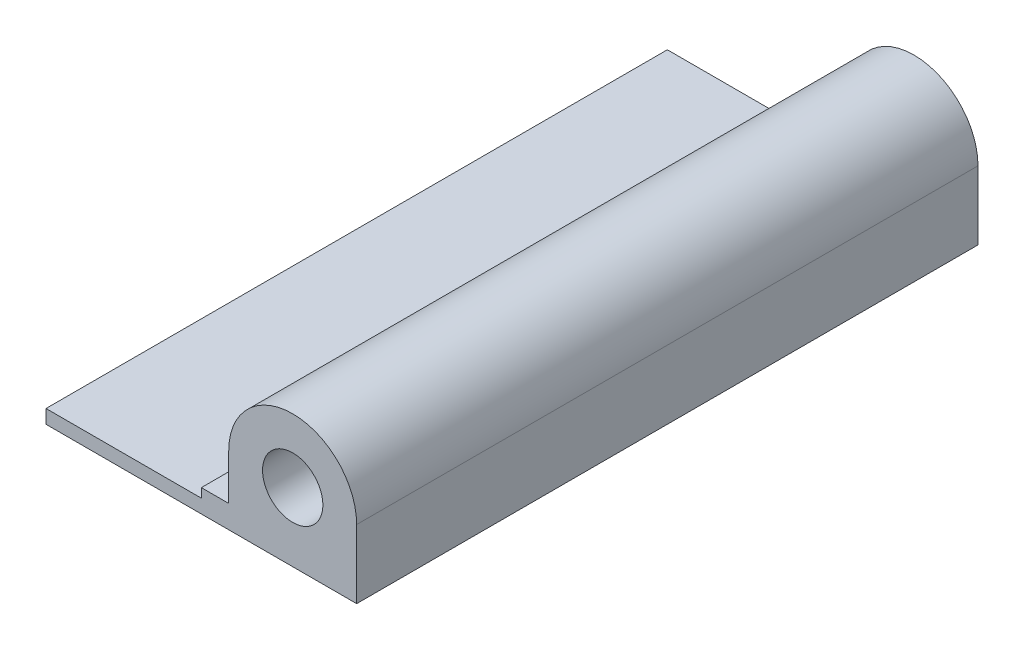
ISO-10303-21;
HEADER;
FILE_DESCRIPTION(('STEP AP214'),'2;1');
FILE_NAME('part.step','',(''),(''),'','','');
FILE_SCHEMA(('AUTOMOTIVE_DESIGN { 1 0 10303 214 1 1 1 1 }'));
ENDSEC;
DATA;
#1=APPLICATION_CONTEXT('core data for automotive mechanical design processes');
#2=APPLICATION_PROTOCOL_DEFINITION('international standard','automotive_design',2000,#1);
#3=PRODUCT_CONTEXT('',#1,'mechanical');
#4=PRODUCT('Part','Part','',(#3));
#5=PRODUCT_RELATED_PRODUCT_CATEGORY('part','',(#4));
#6=PRODUCT_DEFINITION_FORMATION('','',#4);
#7=PRODUCT_DEFINITION_CONTEXT('part definition',#1,'design');
#8=PRODUCT_DEFINITION('design','',#6,#7);
#9=PRODUCT_DEFINITION_SHAPE('','',#8);
#10=(LENGTH_UNIT() NAMED_UNIT(*) SI_UNIT(.MILLI.,.METRE.));
#11=(NAMED_UNIT(*) PLANE_ANGLE_UNIT() SI_UNIT($,.RADIAN.));
#12=(NAMED_UNIT(*) SI_UNIT($,.STERADIAN.) SOLID_ANGLE_UNIT());
#13=UNCERTAINTY_MEASURE_WITH_UNIT(LENGTH_MEASURE(1.E-05),#10,'distance_accuracy_value','');
#14=(GEOMETRIC_REPRESENTATION_CONTEXT(3) GLOBAL_UNCERTAINTY_ASSIGNED_CONTEXT((#13)) GLOBAL_UNIT_ASSIGNED_CONTEXT((#10,
#11,#12)) REPRESENTATION_CONTEXT('',''));
#15=CARTESIAN_POINT('',(0.,0.,0.));
#16=DIRECTION('',(0.,0.,1.));
#17=DIRECTION('',(1.,0.,0.));
#18=AXIS2_PLACEMENT_3D('',#15,#16,#17);
#19=CARTESIAN_POINT('',(27.0000000000141,7.5,0.));
#20=DIRECTION('',(0.,0.,1.));
#21=DIRECTION('',(1.,0.,0.));
#22=AXIS2_PLACEMENT_3D('',#19,#20,#21);
#23=CYLINDRICAL_SURFACE('',#22,7.00000000000012);
#24=CARTESIAN_POINT('',(27.0000000000141,7.5,68.));
#25=DIRECTION('',(0.,0.,1.));
#26=DIRECTION('',(1.,0.,0.));
#27=AXIS2_PLACEMENT_3D('',#24,#25,#26);
#28=CIRCLE('',#27,7.00000000000012);
#29=CARTESIAN_POINT('',(34.0000000000142,7.5,68.));
#30=VERTEX_POINT('',#29);
#31=CARTESIAN_POINT('',(20.000000000014,7.5,68.));
#32=VERTEX_POINT('',#31);
#33=EDGE_CURVE('E132',#30,#32,#28,.T.);
#34=ORIENTED_EDGE('',*,*,#33,.F.);
#35=DIRECTION('',(0.,0.,1.));
#36=VECTOR('',#35,1.);
#37=CARTESIAN_POINT('',(34.0000000000142,7.5,0.));
#38=LINE('',#37,#36);
#39=CARTESIAN_POINT('',(34.0000000000142,7.5,0.));
#40=VERTEX_POINT('',#39);
#41=EDGE_CURVE('E11',#40,#30,#38,.T.);
#42=ORIENTED_EDGE('',*,*,#41,.F.);
#43=CARTESIAN_POINT('',(27.0000000000141,7.5,0.));
#44=DIRECTION('',(0.,0.,1.));
#45=DIRECTION('',(1.,0.,0.));
#46=AXIS2_PLACEMENT_3D('',#43,#44,#45);
#47=CIRCLE('',#46,7.00000000000012);
#48=CARTESIAN_POINT('',(20.000000000014,7.5,0.));
#49=VERTEX_POINT('',#48);
#50=EDGE_CURVE('E153',#40,#49,#47,.T.);
#51=ORIENTED_EDGE('',*,*,#50,.T.);
#52=DIRECTION('',(0.,0.,1.));
#53=VECTOR('',#52,1.);
#54=CARTESIAN_POINT('',(20.000000000014,7.5,0.));
#55=LINE('',#54,#53);
#56=EDGE_CURVE('E38',#49,#32,#55,.T.);
#57=ORIENTED_EDGE('',*,*,#56,.T.);
#58=EDGE_LOOP('',(#34,#42,#51,#57));
#59=FACE_BOUND('',#58,.T.);
#60=ADVANCED_FACE('F35',(#59),#23,.T.);
#61=CARTESIAN_POINT('',(34.0000000000142,0.,0.));
#62=DIRECTION('',(1.,0.,0.));
#63=DIRECTION('',(0.,0.,-1.));
#64=AXIS2_PLACEMENT_3D('',#61,#62,#63);
#65=PLANE('',#64);
#66=DIRECTION('',(0.,1.,0.));
#67=VECTOR('',#66,1.);
#68=CARTESIAN_POINT('',(34.0000000000142,0.,68.));
#69=LINE('',#68,#67);
#70=CARTESIAN_POINT('',(34.0000000000142,0.,68.));
#71=VERTEX_POINT('',#70);
#72=EDGE_CURVE('E151',#71,#30,#69,.T.);
#73=ORIENTED_EDGE('',*,*,#72,.F.);
#74=DIRECTION('',(0.,0.,1.));
#75=VECTOR('',#74,1.);
#76=CARTESIAN_POINT('',(34.0000000000142,0.,0.));
#77=LINE('',#76,#75);
#78=CARTESIAN_POINT('',(34.0000000000142,0.,0.));
#79=VERTEX_POINT('',#78);
#80=EDGE_CURVE('E44',#79,#71,#77,.T.);
#81=ORIENTED_EDGE('',*,*,#80,.F.);
#82=DIRECTION('',(0.,1.,0.));
#83=VECTOR('',#82,1.);
#84=CARTESIAN_POINT('',(34.0000000000142,0.,0.));
#85=LINE('',#84,#83);
#86=EDGE_CURVE('E122',#79,#40,#85,.T.);
#87=ORIENTED_EDGE('',*,*,#86,.T.);
#88=ORIENTED_EDGE('',*,*,#41,.T.);
#89=EDGE_LOOP('',(#73,#81,#87,#88));
#90=FACE_BOUND('',#89,.T.);
#91=ADVANCED_FACE('F165',(#90),#65,.T.);
#92=CARTESIAN_POINT('',(0.,0.,0.));
#93=DIRECTION('',(0.,-1.,0.));
#94=DIRECTION('',(0.,0.,-1.));
#95=AXIS2_PLACEMENT_3D('',#92,#93,#94);
#96=PLANE('',#95);
#97=DIRECTION('',(1.,0.,0.));
#98=VECTOR('',#97,1.);
#99=CARTESIAN_POINT('',(0.,0.,68.));
#100=LINE('',#99,#98);
#101=CARTESIAN_POINT('',(0.,0.,68.));
#102=VERTEX_POINT('',#101);
#103=EDGE_CURVE('E109',#102,#71,#100,.T.);
#104=ORIENTED_EDGE('',*,*,#103,.F.);
#105=DIRECTION('',(0.,0.,1.));
#106=VECTOR('',#105,1.);
#107=CARTESIAN_POINT('',(0.,0.,0.));
#108=LINE('',#107,#106);
#109=CARTESIAN_POINT('',(0.,0.,0.));
#110=VERTEX_POINT('',#109);
#111=EDGE_CURVE('E104',#110,#102,#108,.T.);
#112=ORIENTED_EDGE('',*,*,#111,.F.);
#113=DIRECTION('',(1.,0.,0.));
#114=VECTOR('',#113,1.);
#115=CARTESIAN_POINT('',(0.,0.,0.));
#116=LINE('',#115,#114);
#117=EDGE_CURVE('E107',#110,#79,#116,.T.);
#118=ORIENTED_EDGE('',*,*,#117,.T.);
#119=ORIENTED_EDGE('',*,*,#80,.T.);
#120=EDGE_LOOP('',(#104,#112,#118,#119));
#121=FACE_BOUND('',#120,.T.);
#122=ADVANCED_FACE('F106',(#121),#96,.T.);
#123=CARTESIAN_POINT('',(0.,1.5,0.));
#124=DIRECTION('',(-1.,0.,0.));
#125=DIRECTION('',(0.,0.,1.));
#126=AXIS2_PLACEMENT_3D('',#123,#124,#125);
#127=PLANE('',#126);
#128=DIRECTION('',(0.,-1.,0.));
#129=VECTOR('',#128,1.);
#130=CARTESIAN_POINT('',(0.,1.5,68.));
#131=LINE('',#130,#129);
#132=CARTESIAN_POINT('',(0.,1.5,68.));
#133=VERTEX_POINT('',#132);
#134=EDGE_CURVE('E148',#133,#102,#131,.T.);
#135=ORIENTED_EDGE('',*,*,#134,.F.);
#136=DIRECTION('',(0.,0.,1.));
#137=VECTOR('',#136,1.);
#138=CARTESIAN_POINT('',(0.,1.5,0.));
#139=LINE('',#138,#137);
#140=CARTESIAN_POINT('',(0.,1.5,0.));
#141=VERTEX_POINT('',#140);
#142=EDGE_CURVE('E114',#141,#133,#139,.T.);
#143=ORIENTED_EDGE('',*,*,#142,.F.);
#144=DIRECTION('',(0.,-1.,0.));
#145=VECTOR('',#144,1.);
#146=CARTESIAN_POINT('',(0.,1.5,0.));
#147=LINE('',#146,#145);
#148=EDGE_CURVE('E120',#141,#110,#147,.T.);
#149=ORIENTED_EDGE('',*,*,#148,.T.);
#150=ORIENTED_EDGE('',*,*,#111,.T.);
#151=EDGE_LOOP('',(#135,#143,#149,#150));
#152=FACE_BOUND('',#151,.T.);
#153=ADVANCED_FACE('F124',(#152),#127,.T.);
#154=CARTESIAN_POINT('',(17.,1.5,0.));
#155=DIRECTION('',(0.,1.,0.));
#156=DIRECTION('',(0.,0.,1.));
#157=AXIS2_PLACEMENT_3D('',#154,#155,#156);
#158=PLANE('',#157);
#159=DIRECTION('',(-1.,0.,0.));
#160=VECTOR('',#159,1.);
#161=CARTESIAN_POINT('',(17.,1.5,68.));
#162=LINE('',#161,#160);
#163=CARTESIAN_POINT('',(17.,1.5,68.));
#164=VERTEX_POINT('',#163);
#165=EDGE_CURVE('E145',#164,#133,#162,.T.);
#166=ORIENTED_EDGE('',*,*,#165,.F.);
#167=DIRECTION('',(0.,0.,1.));
#168=VECTOR('',#167,1.);
#169=CARTESIAN_POINT('',(17.,1.5,0.));
#170=LINE('',#169,#168);
#171=CARTESIAN_POINT('',(17.,1.5,0.));
#172=VERTEX_POINT('',#171);
#173=EDGE_CURVE('E157',#172,#164,#170,.T.);
#174=ORIENTED_EDGE('',*,*,#173,.F.);
#175=DIRECTION('',(-1.,0.,0.));
#176=VECTOR('',#175,1.);
#177=CARTESIAN_POINT('',(17.,1.5,0.));
#178=LINE('',#177,#176);
#179=EDGE_CURVE('E125',#172,#141,#178,.T.);
#180=ORIENTED_EDGE('',*,*,#179,.T.);
#181=ORIENTED_EDGE('',*,*,#142,.T.);
#182=EDGE_LOOP('',(#166,#174,#180,#181));
#183=FACE_BOUND('',#182,.T.);
#184=ADVANCED_FACE('F178',(#183),#158,.T.);
#185=CARTESIAN_POINT('',(17.,2.5,0.));
#186=DIRECTION('',(-1.,0.,0.));
#187=DIRECTION('',(0.,0.,1.));
#188=AXIS2_PLACEMENT_3D('',#185,#186,#187);
#189=PLANE('',#188);
#190=DIRECTION('',(0.,-1.,0.));
#191=VECTOR('',#190,1.);
#192=CARTESIAN_POINT('',(17.,2.5,68.));
#193=LINE('',#192,#191);
#194=CARTESIAN_POINT('',(17.,2.5,68.));
#195=VERTEX_POINT('',#194);
#196=EDGE_CURVE('E142',#195,#164,#193,.T.);
#197=ORIENTED_EDGE('',*,*,#196,.F.);
#198=DIRECTION('',(0.,0.,1.));
#199=VECTOR('',#198,1.);
#200=CARTESIAN_POINT('',(17.,2.5,0.));
#201=LINE('',#200,#199);
#202=CARTESIAN_POINT('',(17.,2.5,0.));
#203=VERTEX_POINT('',#202);
#204=EDGE_CURVE('E159',#203,#195,#201,.T.);
#205=ORIENTED_EDGE('',*,*,#204,.F.);
#206=DIRECTION('',(0.,-1.,0.));
#207=VECTOR('',#206,1.);
#208=CARTESIAN_POINT('',(17.,2.5,0.));
#209=LINE('',#208,#207);
#210=EDGE_CURVE('E127',#203,#172,#209,.T.);
#211=ORIENTED_EDGE('',*,*,#210,.T.);
#212=ORIENTED_EDGE('',*,*,#173,.T.);
#213=EDGE_LOOP('',(#197,#205,#211,#212));
#214=FACE_BOUND('',#213,.T.);
#215=ADVANCED_FACE('F181',(#214),#189,.T.);
#216=CARTESIAN_POINT('',(20.000000000014,2.5,0.));
#217=DIRECTION('',(0.,1.,0.));
#218=DIRECTION('',(0.,0.,1.));
#219=AXIS2_PLACEMENT_3D('',#216,#217,#218);
#220=PLANE('',#219);
#221=DIRECTION('',(-1.,0.,0.));
#222=VECTOR('',#221,1.);
#223=CARTESIAN_POINT('',(20.000000000014,2.5,68.));
#224=LINE('',#223,#222);
#225=CARTESIAN_POINT('',(20.000000000014,2.5,68.));
#226=VERTEX_POINT('',#225);
#227=EDGE_CURVE('E139',#226,#195,#224,.T.);
#228=ORIENTED_EDGE('',*,*,#227,.F.);
#229=DIRECTION('',(0.,0.,1.));
#230=VECTOR('',#229,1.);
#231=CARTESIAN_POINT('',(20.000000000014,2.5,0.));
#232=LINE('',#231,#230);
#233=CARTESIAN_POINT('',(20.000000000014,2.5,0.));
#234=VERTEX_POINT('',#233);
#235=EDGE_CURVE('E160',#234,#226,#232,.T.);
#236=ORIENTED_EDGE('',*,*,#235,.F.);
#237=DIRECTION('',(-1.,0.,0.));
#238=VECTOR('',#237,1.);
#239=CARTESIAN_POINT('',(20.000000000014,2.5,0.));
#240=LINE('',#239,#238);
#241=EDGE_CURVE('E216',#234,#203,#240,.T.);
#242=ORIENTED_EDGE('',*,*,#241,.T.);
#243=ORIENTED_EDGE('',*,*,#204,.T.);
#244=EDGE_LOOP('',(#228,#236,#242,#243));
#245=FACE_BOUND('',#244,.T.);
#246=ADVANCED_FACE('F185',(#245),#220,.T.);
#247=CARTESIAN_POINT('',(20.000000000014,7.5,0.));
#248=DIRECTION('',(-1.,0.,0.));
#249=DIRECTION('',(0.,-1.,0.));
#250=AXIS2_PLACEMENT_3D('',#247,#248,#249);
#251=PLANE('',#250);
#252=DIRECTION('',(0.,-1.,0.));
#253=VECTOR('',#252,1.);
#254=CARTESIAN_POINT('',(20.000000000014,7.5,68.));
#255=LINE('',#254,#253);
#256=EDGE_CURVE('E135',#32,#226,#255,.T.);
#257=ORIENTED_EDGE('',*,*,#256,.F.);
#258=ORIENTED_EDGE('',*,*,#56,.F.);
#259=DIRECTION('',(0.,-1.,0.));
#260=VECTOR('',#259,1.);
#261=CARTESIAN_POINT('',(20.000000000014,7.5,0.));
#262=LINE('',#261,#260);
#263=EDGE_CURVE('E214',#49,#234,#262,.T.);
#264=ORIENTED_EDGE('',*,*,#263,.T.);
#265=ORIENTED_EDGE('',*,*,#235,.T.);
#266=EDGE_LOOP('',(#257,#258,#264,#265));
#267=FACE_BOUND('',#266,.T.);
#268=ADVANCED_FACE('F162',(#267),#251,.T.);
#269=CARTESIAN_POINT('',(27.0000000000141,7.5,0.));
#270=DIRECTION('',(0.,0.,1.));
#271=DIRECTION('',(1.,0.,0.));
#272=AXIS2_PLACEMENT_3D('',#269,#270,#271);
#273=PLANE('',#272);
#274=CARTESIAN_POINT('',(27.0000000000141,7.5,0.));
#275=DIRECTION('',(0.,0.,1.));
#276=DIRECTION('',(-1.,0.,0.));
#277=AXIS2_PLACEMENT_3D('',#274,#275,#276);
#278=CIRCLE('',#277,3.30000000001412);
#279=CARTESIAN_POINT('',(23.7,7.5,0.));
#280=VERTEX_POINT('',#279);
#281=EDGE_CURVE('E136',#280,#280,#278,.T.);
#282=ORIENTED_EDGE('',*,*,#281,.T.);
#283=EDGE_LOOP('',(#282));
#284=FACE_BOUND('',#283,.T.);
#285=ORIENTED_EDGE('',*,*,#50,.F.);
#286=ORIENTED_EDGE('',*,*,#86,.F.);
#287=ORIENTED_EDGE('',*,*,#117,.F.);
#288=ORIENTED_EDGE('',*,*,#148,.F.);
#289=ORIENTED_EDGE('',*,*,#179,.F.);
#290=ORIENTED_EDGE('',*,*,#210,.F.);
#291=ORIENTED_EDGE('',*,*,#241,.F.);
#292=ORIENTED_EDGE('',*,*,#263,.F.);
#293=EDGE_LOOP('',(#285,#286,#287,#288,#289,#290,#291,#292));
#294=FACE_BOUND('',#293,.T.);
#295=ADVANCED_FACE('F118',(#284,#294),#273,.F.);
#296=CARTESIAN_POINT('',(27.0000000000141,7.5,68.));
#297=DIRECTION('',(0.,0.,1.));
#298=DIRECTION('',(1.,0.,0.));
#299=AXIS2_PLACEMENT_3D('',#296,#297,#298);
#300=PLANE('',#299);
#301=CARTESIAN_POINT('',(27.0000000000141,7.5,68.));
#302=DIRECTION('',(0.,0.,1.));
#303=DIRECTION('',(-1.,0.,0.));
#304=AXIS2_PLACEMENT_3D('',#301,#302,#303);
#305=CIRCLE('',#304,3.30000000001412);
#306=CARTESIAN_POINT('',(23.7,7.5,68.));
#307=VERTEX_POINT('',#306);
#308=EDGE_CURVE('E209',#307,#307,#305,.T.);
#309=ORIENTED_EDGE('',*,*,#308,.F.);
#310=EDGE_LOOP('',(#309));
#311=FACE_BOUND('',#310,.T.);
#312=ORIENTED_EDGE('',*,*,#33,.T.);
#313=ORIENTED_EDGE('',*,*,#256,.T.);
#314=ORIENTED_EDGE('',*,*,#227,.T.);
#315=ORIENTED_EDGE('',*,*,#196,.T.);
#316=ORIENTED_EDGE('',*,*,#165,.T.);
#317=ORIENTED_EDGE('',*,*,#134,.T.);
#318=ORIENTED_EDGE('',*,*,#103,.T.);
#319=ORIENTED_EDGE('',*,*,#72,.T.);
#320=EDGE_LOOP('',(#312,#313,#314,#315,#316,#317,#318,#319));
#321=FACE_BOUND('',#320,.T.);
#322=ADVANCED_FACE('F164',(#311,#321),#300,.T.);
#323=CARTESIAN_POINT('',(27.0000000000141,7.5,0.));
#324=DIRECTION('',(0.,0.,1.));
#325=DIRECTION('',(1.,0.,0.));
#326=AXIS2_PLACEMENT_3D('',#323,#324,#325);
#327=CYLINDRICAL_SURFACE('',#326,3.30000000001412);
#328=ORIENTED_EDGE('',*,*,#281,.F.);
#329=EDGE_LOOP('',(#328));
#330=FACE_BOUND('',#329,.T.);
#331=ORIENTED_EDGE('',*,*,#308,.T.);
#332=EDGE_LOOP('',(#331));
#333=FACE_BOUND('',#332,.T.);
#334=ADVANCED_FACE('F197',(#330,#333),#327,.F.);
#335=CLOSED_SHELL('',(#60,#91,#122,#153,#184,#215,#246,#268,#295,#322,#334));
#336=MANIFOLD_SOLID_BREP('B2',#335);
#337=ADVANCED_BREP_SHAPE_REPRESENTATION('',(#18,#336),#14);
#338=SHAPE_DEFINITION_REPRESENTATION(#9,#337);
ENDSEC;
END-ISO-10303-21;
